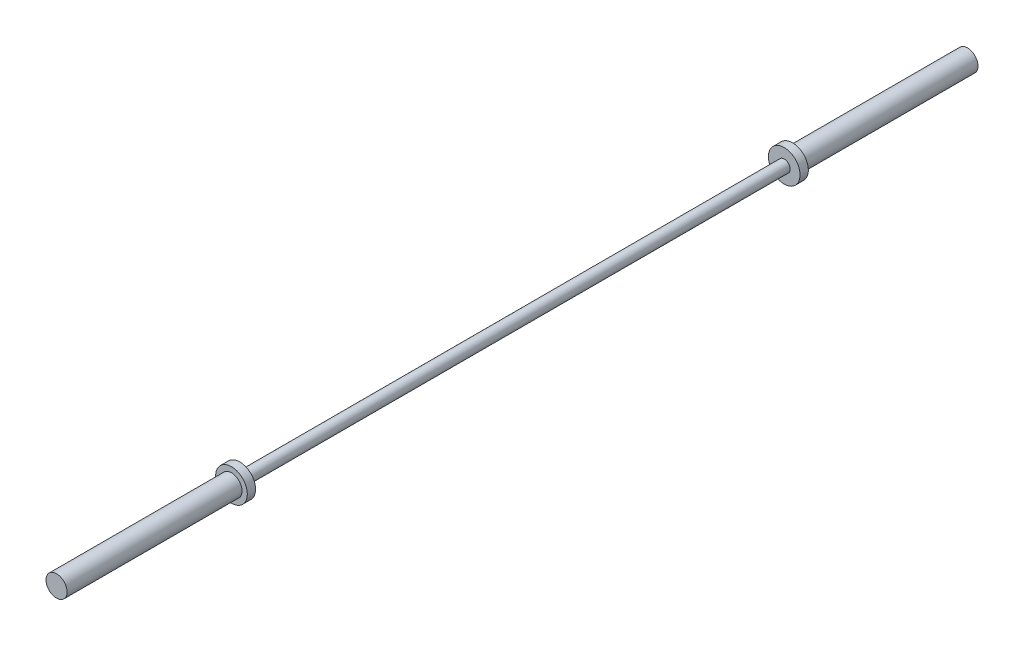
ISO-10303-21;
HEADER;
FILE_DESCRIPTION(('STEP AP214'),'2;1');
FILE_NAME('part.step','',(''),(''),'','','');
FILE_SCHEMA(('AUTOMOTIVE_DESIGN { 1 0 10303 214 1 1 1 1 }'));
ENDSEC;
DATA;
#1=APPLICATION_CONTEXT('core data for automotive mechanical design processes');
#2=APPLICATION_PROTOCOL_DEFINITION('international standard','automotive_design',2000,#1);
#3=PRODUCT_CONTEXT('',#1,'mechanical');
#4=PRODUCT('Part','Part','',(#3));
#5=PRODUCT_RELATED_PRODUCT_CATEGORY('part','',(#4));
#6=PRODUCT_DEFINITION_FORMATION('','',#4);
#7=PRODUCT_DEFINITION_CONTEXT('part definition',#1,'design');
#8=PRODUCT_DEFINITION('design','',#6,#7);
#9=PRODUCT_DEFINITION_SHAPE('','',#8);
#10=(LENGTH_UNIT() NAMED_UNIT(*) SI_UNIT(.MILLI.,.METRE.));
#11=(NAMED_UNIT(*) PLANE_ANGLE_UNIT() SI_UNIT($,.RADIAN.));
#12=(NAMED_UNIT(*) SI_UNIT($,.STERADIAN.) SOLID_ANGLE_UNIT());
#13=UNCERTAINTY_MEASURE_WITH_UNIT(LENGTH_MEASURE(1.E-05),#10,'distance_accuracy_value','');
#14=(GEOMETRIC_REPRESENTATION_CONTEXT(3) GLOBAL_UNCERTAINTY_ASSIGNED_CONTEXT((#13)) GLOBAL_UNIT_ASSIGNED_CONTEXT((#10,
#11,#12)) REPRESENTATION_CONTEXT('',''));
#15=CARTESIAN_POINT('',(0.,0.,0.));
#16=DIRECTION('',(0.,0.,1.));
#17=DIRECTION('',(1.,0.,0.));
#18=AXIS2_PLACEMENT_3D('',#15,#16,#17);
#19=CARTESIAN_POINT('',(0.,25.5,-1100.));
#20=DIRECTION('',(0.,0.,1.));
#21=DIRECTION('',(1.,0.,0.));
#22=AXIS2_PLACEMENT_3D('',#19,#20,#21);
#23=PLANE('',#22);
#24=CARTESIAN_POINT('',(0.,0.,-1100.));
#25=DIRECTION('',(0.,0.,1.));
#26=DIRECTION('',(1.,0.,0.));
#27=AXIS2_PLACEMENT_3D('',#24,#25,#26);
#28=CIRCLE('',#27,25.5);
#29=CARTESIAN_POINT('',(25.5,0.,-1100.));
#30=VERTEX_POINT('',#29);
#31=EDGE_CURVE('E69',#30,#30,#28,.T.);
#32=ORIENTED_EDGE('',*,*,#31,.F.);
#33=EDGE_LOOP('',(#32));
#34=FACE_BOUND('',#33,.T.);
#35=ADVANCED_FACE('F35',(#34),#23,.F.);
#36=CARTESIAN_POINT('',(0.,25.4999999999999,1100.));
#37=DIRECTION('',(0.,0.,-1.));
#38=DIRECTION('',(-1.,0.,0.));
#39=AXIS2_PLACEMENT_3D('',#36,#37,#38);
#40=PLANE('',#39);
#41=CARTESIAN_POINT('',(0.,0.,1100.));
#42=DIRECTION('',(0.,0.,1.));
#43=DIRECTION('',(1.,0.,0.));
#44=AXIS2_PLACEMENT_3D('',#41,#42,#43);
#45=CIRCLE('',#44,25.4999999999999);
#46=CARTESIAN_POINT('',(25.4999999999999,0.,1100.));
#47=VERTEX_POINT('',#46);
#48=EDGE_CURVE('E10',#47,#47,#45,.T.);
#49=ORIENTED_EDGE('',*,*,#48,.T.);
#50=EDGE_LOOP('',(#49));
#51=FACE_BOUND('',#50,.T.);
#52=ADVANCED_FACE('F76',(#51),#40,.F.);
#53=CARTESIAN_POINT('',(0.,0.,0.));
#54=DIRECTION('',(0.,0.,1.));
#55=DIRECTION('',(1.,0.,0.));
#56=AXIS2_PLACEMENT_3D('',#53,#54,#55);
#57=CYLINDRICAL_SURFACE('',#56,25.4999999999999);
#58=ORIENTED_EDGE('',*,*,#48,.F.);
#59=EDGE_LOOP('',(#58));
#60=FACE_BOUND('',#59,.T.);
#61=CARTESIAN_POINT('',(0.,0.,677.5));
#62=DIRECTION('',(0.,0.,1.));
#63=DIRECTION('',(1.,0.,0.));
#64=AXIS2_PLACEMENT_3D('',#61,#62,#63);
#65=CIRCLE('',#64,25.4999999999999);
#66=CARTESIAN_POINT('',(25.4999999999999,0.,677.5));
#67=VERTEX_POINT('',#66);
#68=EDGE_CURVE('E41',#67,#67,#65,.T.);
#69=ORIENTED_EDGE('',*,*,#68,.T.);
#70=EDGE_LOOP('',(#69));
#71=FACE_BOUND('',#70,.T.);
#72=ADVANCED_FACE('F80',(#60,#71),#57,.T.);
#73=CARTESIAN_POINT('',(0.,38.25,677.5));
#74=DIRECTION('',(0.,0.,-1.));
#75=DIRECTION('',(-1.,0.,0.));
#76=AXIS2_PLACEMENT_3D('',#73,#74,#75);
#77=PLANE('',#76);
#78=ORIENTED_EDGE('',*,*,#68,.F.);
#79=EDGE_LOOP('',(#78));
#80=FACE_BOUND('',#79,.T.);
#81=CARTESIAN_POINT('',(0.,0.,677.5));
#82=DIRECTION('',(0.,0.,1.));
#83=DIRECTION('',(1.,0.,0.));
#84=AXIS2_PLACEMENT_3D('',#81,#82,#83);
#85=CIRCLE('',#84,38.25);
#86=CARTESIAN_POINT('',(38.25,0.,677.5));
#87=VERTEX_POINT('',#86);
#88=EDGE_CURVE('E45',#87,#87,#85,.T.);
#89=ORIENTED_EDGE('',*,*,#88,.T.);
#90=EDGE_LOOP('',(#89));
#91=FACE_BOUND('',#90,.T.);
#92=ADVANCED_FACE('F84',(#80,#91),#77,.F.);
#93=CARTESIAN_POINT('',(0.,0.,0.));
#94=DIRECTION('',(0.,0.,1.));
#95=DIRECTION('',(1.,0.,0.));
#96=AXIS2_PLACEMENT_3D('',#93,#94,#95);
#97=CYLINDRICAL_SURFACE('',#96,38.25);
#98=ORIENTED_EDGE('',*,*,#88,.F.);
#99=EDGE_LOOP('',(#98));
#100=FACE_BOUND('',#99,.T.);
#101=CARTESIAN_POINT('',(0.,0.,657.5));
#102=DIRECTION('',(0.,0.,1.));
#103=DIRECTION('',(1.,0.,0.));
#104=AXIS2_PLACEMENT_3D('',#101,#102,#103);
#105=CIRCLE('',#104,38.25);
#106=CARTESIAN_POINT('',(38.25,0.,657.5));
#107=VERTEX_POINT('',#106);
#108=EDGE_CURVE('E49',#107,#107,#105,.T.);
#109=ORIENTED_EDGE('',*,*,#108,.T.);
#110=EDGE_LOOP('',(#109));
#111=FACE_BOUND('',#110,.T.);
#112=ADVANCED_FACE('F90',(#100,#111),#97,.T.);
#113=CARTESIAN_POINT('',(0.,38.25,657.5));
#114=DIRECTION('',(0.,0.,1.));
#115=DIRECTION('',(1.,0.,0.));
#116=AXIS2_PLACEMENT_3D('',#113,#114,#115);
#117=PLANE('',#116);
#118=ORIENTED_EDGE('',*,*,#108,.F.);
#119=EDGE_LOOP('',(#118));
#120=FACE_BOUND('',#119,.T.);
#121=CARTESIAN_POINT('',(0.,0.,657.5));
#122=DIRECTION('',(0.,0.,1.));
#123=DIRECTION('',(1.,0.,0.));
#124=AXIS2_PLACEMENT_3D('',#121,#122,#123);
#125=CIRCLE('',#124,14.25);
#126=CARTESIAN_POINT('',(14.25,0.,657.5));
#127=VERTEX_POINT('',#126);
#128=EDGE_CURVE('E54',#127,#127,#125,.T.);
#129=ORIENTED_EDGE('',*,*,#128,.T.);
#130=EDGE_LOOP('',(#129));
#131=FACE_BOUND('',#130,.T.);
#132=ADVANCED_FACE('F94',(#120,#131),#117,.F.);
#133=CARTESIAN_POINT('',(0.,0.,0.));
#134=DIRECTION('',(0.,0.,1.));
#135=DIRECTION('',(1.,0.,0.));
#136=AXIS2_PLACEMENT_3D('',#133,#134,#135);
#137=CYLINDRICAL_SURFACE('',#136,14.25);
#138=ORIENTED_EDGE('',*,*,#128,.F.);
#139=EDGE_LOOP('',(#138));
#140=FACE_BOUND('',#139,.T.);
#141=CARTESIAN_POINT('',(0.,0.,-657.5));
#142=DIRECTION('',(0.,0.,1.));
#143=DIRECTION('',(1.,0.,0.));
#144=AXIS2_PLACEMENT_3D('',#141,#142,#143);
#145=CIRCLE('',#144,14.2500000000001);
#146=CARTESIAN_POINT('',(14.2500000000001,0.,-657.5));
#147=VERTEX_POINT('',#146);
#148=EDGE_CURVE('E57',#147,#147,#145,.T.);
#149=ORIENTED_EDGE('',*,*,#148,.T.);
#150=EDGE_LOOP('',(#149));
#151=FACE_BOUND('',#150,.T.);
#152=ADVANCED_FACE('F98',(#140,#151),#137,.T.);
#153=CARTESIAN_POINT('',(0.,14.2500000000001,-657.5));
#154=DIRECTION('',(0.,0.,-1.));
#155=DIRECTION('',(-1.,0.,0.));
#156=AXIS2_PLACEMENT_3D('',#153,#154,#155);
#157=PLANE('',#156);
#158=ORIENTED_EDGE('',*,*,#148,.F.);
#159=EDGE_LOOP('',(#158));
#160=FACE_BOUND('',#159,.T.);
#161=CARTESIAN_POINT('',(0.,0.,-657.5));
#162=DIRECTION('',(0.,0.,1.));
#163=DIRECTION('',(1.,0.,0.));
#164=AXIS2_PLACEMENT_3D('',#161,#162,#163);
#165=CIRCLE('',#164,38.25);
#166=CARTESIAN_POINT('',(38.25,0.,-657.5));
#167=VERTEX_POINT('',#166);
#168=EDGE_CURVE('E60',#167,#167,#165,.T.);
#169=ORIENTED_EDGE('',*,*,#168,.T.);
#170=EDGE_LOOP('',(#169));
#171=FACE_BOUND('',#170,.T.);
#172=ADVANCED_FACE('F102',(#160,#171),#157,.F.);
#173=CARTESIAN_POINT('',(0.,0.,0.));
#174=DIRECTION('',(0.,0.,1.));
#175=DIRECTION('',(1.,0.,0.));
#176=AXIS2_PLACEMENT_3D('',#173,#174,#175);
#177=CYLINDRICAL_SURFACE('',#176,38.25);
#178=ORIENTED_EDGE('',*,*,#168,.F.);
#179=EDGE_LOOP('',(#178));
#180=FACE_BOUND('',#179,.T.);
#181=CARTESIAN_POINT('',(0.,0.,-677.5));
#182=DIRECTION('',(0.,0.,1.));
#183=DIRECTION('',(1.,0.,0.));
#184=AXIS2_PLACEMENT_3D('',#181,#182,#183);
#185=CIRCLE('',#184,38.25);
#186=CARTESIAN_POINT('',(38.25,0.,-677.5));
#187=VERTEX_POINT('',#186);
#188=EDGE_CURVE('E63',#187,#187,#185,.T.);
#189=ORIENTED_EDGE('',*,*,#188,.T.);
#190=EDGE_LOOP('',(#189));
#191=FACE_BOUND('',#190,.T.);
#192=ADVANCED_FACE('F106',(#180,#191),#177,.T.);
#193=CARTESIAN_POINT('',(0.,38.25,-677.5));
#194=DIRECTION('',(0.,0.,1.));
#195=DIRECTION('',(1.,0.,0.));
#196=AXIS2_PLACEMENT_3D('',#193,#194,#195);
#197=PLANE('',#196);
#198=ORIENTED_EDGE('',*,*,#188,.F.);
#199=EDGE_LOOP('',(#198));
#200=FACE_BOUND('',#199,.T.);
#201=CARTESIAN_POINT('',(0.,0.,-677.5));
#202=DIRECTION('',(0.,0.,1.));
#203=DIRECTION('',(1.,0.,0.));
#204=AXIS2_PLACEMENT_3D('',#201,#202,#203);
#205=CIRCLE('',#204,25.5);
#206=CARTESIAN_POINT('',(25.5,0.,-677.5));
#207=VERTEX_POINT('',#206);
#208=EDGE_CURVE('E66',#207,#207,#205,.T.);
#209=ORIENTED_EDGE('',*,*,#208,.T.);
#210=EDGE_LOOP('',(#209));
#211=FACE_BOUND('',#210,.T.);
#212=ADVANCED_FACE('F110',(#200,#211),#197,.F.);
#213=CARTESIAN_POINT('',(0.,0.,0.));
#214=DIRECTION('',(0.,0.,1.));
#215=DIRECTION('',(1.,0.,0.));
#216=AXIS2_PLACEMENT_3D('',#213,#214,#215);
#217=CYLINDRICAL_SURFACE('',#216,25.5);
#218=ORIENTED_EDGE('',*,*,#208,.F.);
#219=EDGE_LOOP('',(#218));
#220=FACE_BOUND('',#219,.T.);
#221=ORIENTED_EDGE('',*,*,#31,.T.);
#222=EDGE_LOOP('',(#221));
#223=FACE_BOUND('',#222,.T.);
#224=ADVANCED_FACE('F73',(#220,#223),#217,.T.);
#225=CLOSED_SHELL('',(#35,#52,#72,#92,#112,#132,#152,#172,#192,#212,#224));
#226=MANIFOLD_SOLID_BREP('B2',#225);
#227=ADVANCED_BREP_SHAPE_REPRESENTATION('',(#18,#226),#14);
#228=SHAPE_DEFINITION_REPRESENTATION(#9,#227);
ENDSEC;
END-ISO-10303-21;
